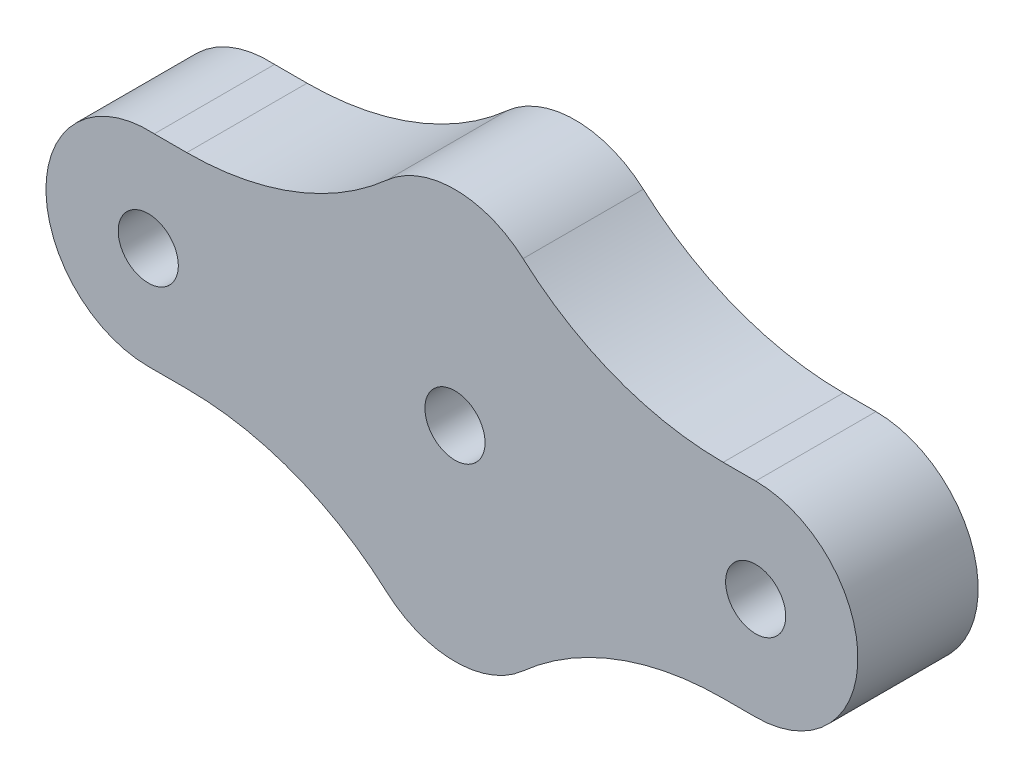
ISO-10303-21;
HEADER;
FILE_DESCRIPTION(('STEP AP214'),'2;1');
FILE_NAME('part.step','',(''),(''),'','','');
FILE_SCHEMA(('AUTOMOTIVE_DESIGN { 1 0 10303 214 1 1 1 1 }'));
ENDSEC;
DATA;
#1=APPLICATION_CONTEXT('core data for automotive mechanical design processes');
#2=APPLICATION_PROTOCOL_DEFINITION('international standard','automotive_design',2000,#1);
#3=PRODUCT_CONTEXT('',#1,'mechanical');
#4=PRODUCT('Part','Part','',(#3));
#5=PRODUCT_RELATED_PRODUCT_CATEGORY('part','',(#4));
#6=PRODUCT_DEFINITION_FORMATION('','',#4);
#7=PRODUCT_DEFINITION_CONTEXT('part definition',#1,'design');
#8=PRODUCT_DEFINITION('design','',#6,#7);
#9=PRODUCT_DEFINITION_SHAPE('','',#8);
#10=(LENGTH_UNIT() NAMED_UNIT(*) SI_UNIT(.MILLI.,.METRE.));
#11=(NAMED_UNIT(*) PLANE_ANGLE_UNIT() SI_UNIT($,.RADIAN.));
#12=(NAMED_UNIT(*) SI_UNIT($,.STERADIAN.) SOLID_ANGLE_UNIT());
#13=UNCERTAINTY_MEASURE_WITH_UNIT(LENGTH_MEASURE(1.E-05),#10,'distance_accuracy_value','');
#14=(GEOMETRIC_REPRESENTATION_CONTEXT(3) GLOBAL_UNCERTAINTY_ASSIGNED_CONTEXT((#13)) GLOBAL_UNIT_ASSIGNED_CONTEXT((#10,
#11,#12)) REPRESENTATION_CONTEXT('',''));
#15=CARTESIAN_POINT('',(0.,0.,0.));
#16=DIRECTION('',(0.,0.,1.));
#17=DIRECTION('',(1.,0.,0.));
#18=AXIS2_PLACEMENT_3D('',#15,#16,#17);
#19=CARTESIAN_POINT('',(-0.1,-1.69852941176471,2.));
#20=DIRECTION('',(0.,0.,-1.));
#21=DIRECTION('',(-1.,0.,0.));
#22=AXIS2_PLACEMENT_3D('',#19,#20,#21);
#23=PLANE('',#22);
#24=CARTESIAN_POINT('',(-0.1,-1.69852941176471,2.));
#25=DIRECTION('',(0.,0.,1.));
#26=DIRECTION('',(-1.,0.,0.));
#27=AXIS2_PLACEMENT_3D('',#24,#25,#26);
#28=CIRCLE('',#27,1.70147058823529);
#29=CARTESIAN_POINT('',(0.,0.,2.));
#30=VERTEX_POINT('',#29);
#31=CARTESIAN_POINT('',(-0.1,-3.4,2.));
#32=VERTEX_POINT('',#31);
#33=EDGE_CURVE('E127',#30,#32,#28,.T.);
#34=ORIENTED_EDGE('',*,*,#33,.T.);
#35=DIRECTION('',(1.,0.,0.));
#36=VECTOR('',#35,1.);
#37=CARTESIAN_POINT('',(3.3,-3.4,2.));
#38=LINE('',#37,#36);
#39=CARTESIAN_POINT('',(0.540179375804449,-3.4,2.));
#40=VERTEX_POINT('',#39);
#41=EDGE_CURVE('E118',#32,#40,#38,.T.);
#42=ORIENTED_EDGE('',*,*,#41,.T.);
#43=CARTESIAN_POINT('',(0.54017937580445,-8.4,2.));
#44=DIRECTION('',(0.,0.,-1.));
#45=DIRECTION('',(-1.,0.,0.));
#46=AXIS2_PLACEMENT_3D('',#43,#44,#45);
#47=CIRCLE('',#46,5.);
#48=CARTESIAN_POINT('',(3.86840372221904,-4.66865671641791,2.));
#49=VERTEX_POINT('',#48);
#50=EDGE_CURVE('E11',#40,#49,#47,.T.);
#51=ORIENTED_EDGE('',*,*,#50,.T.);
#52=CARTESIAN_POINT('',(5.,-3.4,2.));
#53=DIRECTION('',(0.,0.,1.));
#54=DIRECTION('',(-1.,0.,0.));
#55=AXIS2_PLACEMENT_3D('',#52,#53,#54);
#56=CIRCLE('',#55,1.7);
#57=CARTESIAN_POINT('',(6.13159627778096,-4.66865671641791,2.));
#58=VERTEX_POINT('',#57);
#59=EDGE_CURVE('E126',#49,#58,#56,.T.);
#60=ORIENTED_EDGE('',*,*,#59,.T.);
#61=CARTESIAN_POINT('',(9.45982062419555,-8.4,2.));
#62=DIRECTION('',(0.,0.,-1.));
#63=DIRECTION('',(-1.,0.,0.));
#64=AXIS2_PLACEMENT_3D('',#61,#62,#63);
#65=CIRCLE('',#64,5.);
#66=CARTESIAN_POINT('',(9.45982062419555,-3.4,2.));
#67=VERTEX_POINT('',#66);
#68=EDGE_CURVE('E169',#58,#67,#65,.T.);
#69=ORIENTED_EDGE('',*,*,#68,.T.);
#70=DIRECTION('',(1.,0.,0.));
#71=VECTOR('',#70,1.);
#72=CARTESIAN_POINT('',(10.,-3.4,2.));
#73=LINE('',#72,#71);
#74=CARTESIAN_POINT('',(10.,-3.4,2.));
#75=VERTEX_POINT('',#74);
#76=EDGE_CURVE('E226',#67,#75,#73,.T.);
#77=ORIENTED_EDGE('',*,*,#76,.T.);
#78=CARTESIAN_POINT('',(10.,-1.7,2.));
#79=DIRECTION('',(0.,0.,1.));
#80=DIRECTION('',(-1.,0.,0.));
#81=AXIS2_PLACEMENT_3D('',#78,#79,#80);
#82=CIRCLE('',#81,1.7);
#83=CARTESIAN_POINT('',(10.,0.,2.));
#84=VERTEX_POINT('',#83);
#85=EDGE_CURVE('E223',#75,#84,#82,.T.);
#86=ORIENTED_EDGE('',*,*,#85,.T.);
#87=DIRECTION('',(-1.,0.,0.));
#88=VECTOR('',#87,1.);
#89=CARTESIAN_POINT('',(6.7,0.,2.));
#90=LINE('',#89,#88);
#91=CARTESIAN_POINT('',(9.45982062419555,0.,2.));
#92=VERTEX_POINT('',#91);
#93=EDGE_CURVE('E215',#84,#92,#90,.T.);
#94=ORIENTED_EDGE('',*,*,#93,.T.);
#95=CARTESIAN_POINT('',(9.45982062419555,5.,2.));
#96=DIRECTION('',(0.,0.,-1.));
#97=DIRECTION('',(-1.,0.,0.));
#98=AXIS2_PLACEMENT_3D('',#95,#96,#97);
#99=CIRCLE('',#98,5.);
#100=CARTESIAN_POINT('',(6.13159627778096,1.26865671641791,2.));
#101=VERTEX_POINT('',#100);
#102=EDGE_CURVE('E173',#92,#101,#99,.T.);
#103=ORIENTED_EDGE('',*,*,#102,.T.);
#104=CARTESIAN_POINT('',(5.,0.,2.));
#105=DIRECTION('',(0.,0.,1.));
#106=DIRECTION('',(-1.,0.,0.));
#107=AXIS2_PLACEMENT_3D('',#104,#105,#106);
#108=CIRCLE('',#107,1.7);
#109=CARTESIAN_POINT('',(3.86840372221904,1.26865671641791,2.));
#110=VERTEX_POINT('',#109);
#111=EDGE_CURVE('E181',#101,#110,#108,.T.);
#112=ORIENTED_EDGE('',*,*,#111,.T.);
#113=CARTESIAN_POINT('',(0.540179375804448,5.,2.));
#114=DIRECTION('',(0.,0.,-1.));
#115=DIRECTION('',(-1.,0.,0.));
#116=AXIS2_PLACEMENT_3D('',#113,#114,#115);
#117=CIRCLE('',#116,5.);
#118=CARTESIAN_POINT('',(0.540179375804448,0.,2.));
#119=VERTEX_POINT('',#118);
#120=EDGE_CURVE('E177',#110,#119,#117,.T.);
#121=ORIENTED_EDGE('',*,*,#120,.T.);
#122=DIRECTION('',(-1.,0.,0.));
#123=VECTOR('',#122,1.);
#124=CARTESIAN_POINT('',(0.,0.,2.));
#125=LINE('',#124,#123);
#126=EDGE_CURVE('E132',#119,#30,#125,.T.);
#127=ORIENTED_EDGE('',*,*,#126,.T.);
#128=EDGE_LOOP('',(#34,#42,#51,#60,#69,#77,#86,#94,#103,#112,#121,#127));
#129=FACE_BOUND('',#128,.T.);
#130=CARTESIAN_POINT('',(-0.1,-1.69852941176471,2.));
#131=DIRECTION('',(0.,0.,1.));
#132=DIRECTION('',(1.,0.,0.));
#133=AXIS2_PLACEMENT_3D('',#130,#131,#132);
#134=CIRCLE('',#133,0.5);
#135=CARTESIAN_POINT('',(0.4,-1.69852941176471,2.));
#136=VERTEX_POINT('',#135);
#137=EDGE_CURVE('E232',#136,#136,#134,.T.);
#138=ORIENTED_EDGE('',*,*,#137,.F.);
#139=EDGE_LOOP('',(#138));
#140=FACE_BOUND('',#139,.T.);
#141=CARTESIAN_POINT('',(10.,-1.7,2.));
#142=DIRECTION('',(0.,0.,1.));
#143=DIRECTION('',(1.,0.,0.));
#144=AXIS2_PLACEMENT_3D('',#141,#142,#143);
#145=CIRCLE('',#144,0.500000000000001);
#146=CARTESIAN_POINT('',(10.5,-1.7,2.));
#147=VERTEX_POINT('',#146);
#148=EDGE_CURVE('E258',#147,#147,#145,.T.);
#149=ORIENTED_EDGE('',*,*,#148,.F.);
#150=EDGE_LOOP('',(#149));
#151=FACE_BOUND('',#150,.T.);
#152=CARTESIAN_POINT('',(5.,-1.7,2.));
#153=DIRECTION('',(0.,0.,1.));
#154=DIRECTION('',(1.,0.,0.));
#155=AXIS2_PLACEMENT_3D('',#152,#153,#154);
#156=CIRCLE('',#155,0.5);
#157=CARTESIAN_POINT('',(5.5,-1.7,2.));
#158=VERTEX_POINT('',#157);
#159=EDGE_CURVE('E264',#158,#158,#156,.T.);
#160=ORIENTED_EDGE('',*,*,#159,.F.);
#161=EDGE_LOOP('',(#160));
#162=FACE_BOUND('',#161,.T.);
#163=ADVANCED_FACE('F33',(#129,#140,#151,#162),#23,.F.);
#164=CARTESIAN_POINT('',(-0.1,-1.69852941176471,0.));
#165=DIRECTION('',(0.,0.,-1.));
#166=DIRECTION('',(-1.,0.,0.));
#167=AXIS2_PLACEMENT_3D('',#164,#165,#166);
#168=PLANE('',#167);
#169=CARTESIAN_POINT('',(10.,-1.7,0.));
#170=DIRECTION('',(0.,0.,1.));
#171=DIRECTION('',(1.,0.,0.));
#172=AXIS2_PLACEMENT_3D('',#169,#170,#171);
#173=CIRCLE('',#172,0.500000000000001);
#174=CARTESIAN_POINT('',(10.5,-1.7,0.));
#175=VERTEX_POINT('',#174);
#176=EDGE_CURVE('E261',#175,#175,#173,.T.);
#177=ORIENTED_EDGE('',*,*,#176,.T.);
#178=EDGE_LOOP('',(#177));
#179=FACE_BOUND('',#178,.T.);
#180=CARTESIAN_POINT('',(-0.1,-1.69852941176471,0.));
#181=DIRECTION('',(0.,0.,1.));
#182=DIRECTION('',(-1.,0.,0.));
#183=AXIS2_PLACEMENT_3D('',#180,#181,#182);
#184=CIRCLE('',#183,1.70147058823529);
#185=CARTESIAN_POINT('',(0.,0.,0.));
#186=VERTEX_POINT('',#185);
#187=CARTESIAN_POINT('',(-0.1,-3.4,0.));
#188=VERTEX_POINT('',#187);
#189=EDGE_CURVE('E140',#186,#188,#184,.T.);
#190=ORIENTED_EDGE('',*,*,#189,.F.);
#191=DIRECTION('',(-1.,0.,0.));
#192=VECTOR('',#191,1.);
#193=CARTESIAN_POINT('',(0.,0.,0.));
#194=LINE('',#193,#192);
#195=CARTESIAN_POINT('',(0.540179375804448,0.,0.));
#196=VERTEX_POINT('',#195);
#197=EDGE_CURVE('E136',#196,#186,#194,.T.);
#198=ORIENTED_EDGE('',*,*,#197,.F.);
#199=CARTESIAN_POINT('',(0.540179375804448,5.,0.));
#200=DIRECTION('',(0.,0.,-1.));
#201=DIRECTION('',(-1.,0.,0.));
#202=AXIS2_PLACEMENT_3D('',#199,#200,#201);
#203=CIRCLE('',#202,5.);
#204=CARTESIAN_POINT('',(3.86840372221904,1.26865671641791,0.));
#205=VERTEX_POINT('',#204);
#206=EDGE_CURVE('E175',#196,#205,#203,.F.);
#207=ORIENTED_EDGE('',*,*,#206,.T.);
#208=CARTESIAN_POINT('',(5.,0.,0.));
#209=DIRECTION('',(0.,0.,1.));
#210=DIRECTION('',(-1.,0.,0.));
#211=AXIS2_PLACEMENT_3D('',#208,#209,#210);
#212=CIRCLE('',#211,1.7);
#213=CARTESIAN_POINT('',(6.13159627778096,1.26865671641791,0.));
#214=VERTEX_POINT('',#213);
#215=EDGE_CURVE('E195',#214,#205,#212,.T.);
#216=ORIENTED_EDGE('',*,*,#215,.F.);
#217=CARTESIAN_POINT('',(9.45982062419555,5.,0.));
#218=DIRECTION('',(0.,0.,-1.));
#219=DIRECTION('',(-1.,0.,0.));
#220=AXIS2_PLACEMENT_3D('',#217,#218,#219);
#221=CIRCLE('',#220,5.);
#222=CARTESIAN_POINT('',(9.45982062419555,0.,0.));
#223=VERTEX_POINT('',#222);
#224=EDGE_CURVE('E171',#214,#223,#221,.F.);
#225=ORIENTED_EDGE('',*,*,#224,.T.);
#226=DIRECTION('',(-1.,0.,0.));
#227=VECTOR('',#226,1.);
#228=CARTESIAN_POINT('',(6.7,0.,0.));
#229=LINE('',#228,#227);
#230=CARTESIAN_POINT('',(10.,0.,0.));
#231=VERTEX_POINT('',#230);
#232=EDGE_CURVE('E199',#231,#223,#229,.T.);
#233=ORIENTED_EDGE('',*,*,#232,.F.);
#234=CARTESIAN_POINT('',(10.,-1.7,0.));
#235=DIRECTION('',(0.,0.,1.));
#236=DIRECTION('',(-1.,0.,0.));
#237=AXIS2_PLACEMENT_3D('',#234,#235,#236);
#238=CIRCLE('',#237,1.7);
#239=CARTESIAN_POINT('',(10.,-3.4,0.));
#240=VERTEX_POINT('',#239);
#241=EDGE_CURVE('E203',#240,#231,#238,.T.);
#242=ORIENTED_EDGE('',*,*,#241,.F.);
#243=DIRECTION('',(1.,0.,0.));
#244=VECTOR('',#243,1.);
#245=CARTESIAN_POINT('',(10.,-3.4,0.));
#246=LINE('',#245,#244);
#247=CARTESIAN_POINT('',(9.45982062419555,-3.4,0.));
#248=VERTEX_POINT('',#247);
#249=EDGE_CURVE('E237',#248,#240,#246,.T.);
#250=ORIENTED_EDGE('',*,*,#249,.F.);
#251=CARTESIAN_POINT('',(9.45982062419555,-8.4,0.));
#252=DIRECTION('',(0.,0.,-1.));
#253=DIRECTION('',(-1.,0.,0.));
#254=AXIS2_PLACEMENT_3D('',#251,#252,#253);
#255=CIRCLE('',#254,5.);
#256=CARTESIAN_POINT('',(6.13159627778096,-4.66865671641791,0.));
#257=VERTEX_POINT('',#256);
#258=EDGE_CURVE('E167',#248,#257,#255,.F.);
#259=ORIENTED_EDGE('',*,*,#258,.T.);
#260=CARTESIAN_POINT('',(5.,-3.4,0.));
#261=DIRECTION('',(0.,0.,1.));
#262=DIRECTION('',(-1.,0.,0.));
#263=AXIS2_PLACEMENT_3D('',#260,#261,#262);
#264=CIRCLE('',#263,1.7);
#265=CARTESIAN_POINT('',(3.86840372221904,-4.66865671641791,0.));
#266=VERTEX_POINT('',#265);
#267=EDGE_CURVE('E234',#266,#257,#264,.T.);
#268=ORIENTED_EDGE('',*,*,#267,.F.);
#269=CARTESIAN_POINT('',(0.54017937580445,-8.4,0.));
#270=DIRECTION('',(0.,0.,-1.));
#271=DIRECTION('',(-1.,0.,0.));
#272=AXIS2_PLACEMENT_3D('',#269,#270,#271);
#273=CIRCLE('',#272,5.);
#274=CARTESIAN_POINT('',(0.540179375804449,-3.4,0.));
#275=VERTEX_POINT('',#274);
#276=EDGE_CURVE('E41',#266,#275,#273,.F.);
#277=ORIENTED_EDGE('',*,*,#276,.T.);
#278=DIRECTION('',(1.,0.,0.));
#279=VECTOR('',#278,1.);
#280=CARTESIAN_POINT('',(3.3,-3.4,0.));
#281=LINE('',#280,#279);
#282=EDGE_CURVE('E231',#188,#275,#281,.T.);
#283=ORIENTED_EDGE('',*,*,#282,.F.);
#284=EDGE_LOOP('',(#190,#198,#207,#216,#225,#233,#242,#250,#259,#268,#277,#283));
#285=FACE_BOUND('',#284,.T.);
#286=CARTESIAN_POINT('',(-0.1,-1.69852941176471,0.));
#287=DIRECTION('',(0.,0.,1.));
#288=DIRECTION('',(1.,0.,0.));
#289=AXIS2_PLACEMENT_3D('',#286,#287,#288);
#290=CIRCLE('',#289,0.5);
#291=CARTESIAN_POINT('',(0.4,-1.69852941176471,0.));
#292=VERTEX_POINT('',#291);
#293=EDGE_CURVE('E255',#292,#292,#290,.T.);
#294=ORIENTED_EDGE('',*,*,#293,.T.);
#295=EDGE_LOOP('',(#294));
#296=FACE_BOUND('',#295,.T.);
#297=CARTESIAN_POINT('',(5.,-1.7,0.));
#298=DIRECTION('',(0.,0.,1.));
#299=DIRECTION('',(1.,0.,0.));
#300=AXIS2_PLACEMENT_3D('',#297,#298,#299);
#301=CIRCLE('',#300,0.5);
#302=CARTESIAN_POINT('',(5.5,-1.7,0.));
#303=VERTEX_POINT('',#302);
#304=EDGE_CURVE('E267',#303,#303,#301,.T.);
#305=ORIENTED_EDGE('',*,*,#304,.T.);
#306=EDGE_LOOP('',(#305));
#307=FACE_BOUND('',#306,.T.);
#308=ADVANCED_FACE('F193',(#179,#285,#296,#307),#168,.T.);
#309=CARTESIAN_POINT('',(-0.1,-1.69852941176471,2.));
#310=DIRECTION('',(0.,0.,-1.));
#311=DIRECTION('',(-1.,0.,0.));
#312=AXIS2_PLACEMENT_3D('',#309,#310,#311);
#313=CYLINDRICAL_SURFACE('',#312,1.70147058823529);
#314=ORIENTED_EDGE('',*,*,#189,.T.);
#315=DIRECTION('',(0.,0.,-1.));
#316=VECTOR('',#315,1.);
#317=CARTESIAN_POINT('',(-0.1,-3.4,2.));
#318=LINE('',#317,#316);
#319=EDGE_CURVE('E122',#32,#188,#318,.T.);
#320=ORIENTED_EDGE('',*,*,#319,.F.);
#321=ORIENTED_EDGE('',*,*,#33,.F.);
#322=DIRECTION('',(0.,0.,-1.));
#323=VECTOR('',#322,1.);
#324=CARTESIAN_POINT('',(0.,0.,2.));
#325=LINE('',#324,#323);
#326=EDGE_CURVE('E188',#30,#186,#325,.T.);
#327=ORIENTED_EDGE('',*,*,#326,.T.);
#328=EDGE_LOOP('',(#314,#320,#321,#327));
#329=FACE_BOUND('',#328,.T.);
#330=ADVANCED_FACE('F138',(#329),#313,.T.);
#331=CARTESIAN_POINT('',(3.3,-3.4,2.));
#332=DIRECTION('',(0.,1.,0.));
#333=DIRECTION('',(-1.,0.,0.));
#334=AXIS2_PLACEMENT_3D('',#331,#332,#333);
#335=PLANE('',#334);
#336=ORIENTED_EDGE('',*,*,#282,.T.);
#337=DIRECTION('',(0.,0.,1.));
#338=VECTOR('',#337,1.);
#339=CARTESIAN_POINT('',(0.540179375804449,-3.4,2.));
#340=LINE('',#339,#338);
#341=EDGE_CURVE('E48',#275,#40,#340,.T.);
#342=ORIENTED_EDGE('',*,*,#341,.T.);
#343=ORIENTED_EDGE('',*,*,#41,.F.);
#344=ORIENTED_EDGE('',*,*,#319,.T.);
#345=EDGE_LOOP('',(#336,#342,#343,#344));
#346=FACE_BOUND('',#345,.T.);
#347=ADVANCED_FACE('F120',(#346),#335,.F.);
#348=CARTESIAN_POINT('',(5.,-3.4,2.));
#349=DIRECTION('',(0.,0.,-1.));
#350=DIRECTION('',(-1.,0.,0.));
#351=AXIS2_PLACEMENT_3D('',#348,#349,#350);
#352=CYLINDRICAL_SURFACE('',#351,1.7);
#353=ORIENTED_EDGE('',*,*,#267,.T.);
#354=DIRECTION('',(0.,0.,-1.));
#355=VECTOR('',#354,1.);
#356=CARTESIAN_POINT('',(6.13159627778096,-4.66865671641791,2.));
#357=LINE('',#356,#355);
#358=EDGE_CURVE('E154',#257,#58,#357,.F.);
#359=ORIENTED_EDGE('',*,*,#358,.T.);
#360=ORIENTED_EDGE('',*,*,#59,.F.);
#361=DIRECTION('',(0.,0.,-1.));
#362=VECTOR('',#361,1.);
#363=CARTESIAN_POINT('',(3.86840372221904,-4.66865671641791,2.));
#364=LINE('',#363,#362);
#365=EDGE_CURVE('E145',#49,#266,#364,.T.);
#366=ORIENTED_EDGE('',*,*,#365,.T.);
#367=EDGE_LOOP('',(#353,#359,#360,#366));
#368=FACE_BOUND('',#367,.T.);
#369=ADVANCED_FACE('F247',(#368),#352,.T.);
#370=CARTESIAN_POINT('',(10.,-3.4,2.));
#371=DIRECTION('',(0.,1.,0.));
#372=DIRECTION('',(-1.,0.,0.));
#373=AXIS2_PLACEMENT_3D('',#370,#371,#372);
#374=PLANE('',#373);
#375=ORIENTED_EDGE('',*,*,#76,.F.);
#376=DIRECTION('',(0.,0.,1.));
#377=VECTOR('',#376,1.);
#378=CARTESIAN_POINT('',(9.45982062419555,-3.4,0.));
#379=LINE('',#378,#377);
#380=EDGE_CURVE('E141',#67,#248,#379,.F.);
#381=ORIENTED_EDGE('',*,*,#380,.T.);
#382=ORIENTED_EDGE('',*,*,#249,.T.);
#383=DIRECTION('',(0.,0.,-1.));
#384=VECTOR('',#383,1.);
#385=CARTESIAN_POINT('',(10.,-3.4,2.));
#386=LINE('',#385,#384);
#387=EDGE_CURVE('E142',#75,#240,#386,.T.);
#388=ORIENTED_EDGE('',*,*,#387,.F.);
#389=EDGE_LOOP('',(#375,#381,#382,#388));
#390=FACE_BOUND('',#389,.T.);
#391=ADVANCED_FACE('F242',(#390),#374,.F.);
#392=CARTESIAN_POINT('',(10.,-1.7,2.));
#393=DIRECTION('',(0.,0.,-1.));
#394=DIRECTION('',(-1.,0.,0.));
#395=AXIS2_PLACEMENT_3D('',#392,#393,#394);
#396=CYLINDRICAL_SURFACE('',#395,1.7);
#397=ORIENTED_EDGE('',*,*,#241,.T.);
#398=DIRECTION('',(0.,0.,-1.));
#399=VECTOR('',#398,1.);
#400=CARTESIAN_POINT('',(10.,0.,2.));
#401=LINE('',#400,#399);
#402=EDGE_CURVE('E148',#84,#231,#401,.T.);
#403=ORIENTED_EDGE('',*,*,#402,.F.);
#404=ORIENTED_EDGE('',*,*,#85,.F.);
#405=ORIENTED_EDGE('',*,*,#387,.T.);
#406=EDGE_LOOP('',(#397,#403,#404,#405));
#407=FACE_BOUND('',#406,.T.);
#408=ADVANCED_FACE('F238',(#407),#396,.T.);
#409=CARTESIAN_POINT('',(6.7,0.,2.));
#410=DIRECTION('',(0.,-1.,0.));
#411=DIRECTION('',(0.,0.,-1.));
#412=AXIS2_PLACEMENT_3D('',#409,#410,#411);
#413=PLANE('',#412);
#414=ORIENTED_EDGE('',*,*,#232,.T.);
#415=DIRECTION('',(0.,0.,1.));
#416=VECTOR('',#415,1.);
#417=CARTESIAN_POINT('',(9.45982062419555,0.,2.));
#418=LINE('',#417,#416);
#419=EDGE_CURVE('E161',#223,#92,#418,.T.);
#420=ORIENTED_EDGE('',*,*,#419,.T.);
#421=ORIENTED_EDGE('',*,*,#93,.F.);
#422=ORIENTED_EDGE('',*,*,#402,.T.);
#423=EDGE_LOOP('',(#414,#420,#421,#422));
#424=FACE_BOUND('',#423,.T.);
#425=ADVANCED_FACE('F212',(#424),#413,.F.);
#426=CARTESIAN_POINT('',(5.,0.,2.));
#427=DIRECTION('',(0.,0.,-1.));
#428=DIRECTION('',(-1.,0.,0.));
#429=AXIS2_PLACEMENT_3D('',#426,#427,#428);
#430=CYLINDRICAL_SURFACE('',#429,1.7);
#431=ORIENTED_EDGE('',*,*,#111,.F.);
#432=DIRECTION('',(0.,0.,-1.));
#433=VECTOR('',#432,1.);
#434=CARTESIAN_POINT('',(6.13159627778096,1.26865671641791,2.));
#435=LINE('',#434,#433);
#436=EDGE_CURVE('E158',#101,#214,#435,.T.);
#437=ORIENTED_EDGE('',*,*,#436,.T.);
#438=ORIENTED_EDGE('',*,*,#215,.T.);
#439=DIRECTION('',(0.,0.,-1.));
#440=VECTOR('',#439,1.);
#441=CARTESIAN_POINT('',(3.86840372221904,1.26865671641791,2.));
#442=LINE('',#441,#440);
#443=EDGE_CURVE('E156',#205,#110,#442,.F.);
#444=ORIENTED_EDGE('',*,*,#443,.T.);
#445=EDGE_LOOP('',(#431,#437,#438,#444));
#446=FACE_BOUND('',#445,.T.);
#447=ADVANCED_FACE('F197',(#446),#430,.T.);
#448=CARTESIAN_POINT('',(0.,0.,2.));
#449=DIRECTION('',(0.,-1.,0.));
#450=DIRECTION('',(0.,0.,-1.));
#451=AXIS2_PLACEMENT_3D('',#448,#449,#450);
#452=PLANE('',#451);
#453=ORIENTED_EDGE('',*,*,#126,.F.);
#454=DIRECTION('',(0.,0.,1.));
#455=VECTOR('',#454,1.);
#456=CARTESIAN_POINT('',(0.540179375804448,0.,0.));
#457=LINE('',#456,#455);
#458=EDGE_CURVE('E163',#119,#196,#457,.F.);
#459=ORIENTED_EDGE('',*,*,#458,.T.);
#460=ORIENTED_EDGE('',*,*,#197,.T.);
#461=ORIENTED_EDGE('',*,*,#326,.F.);
#462=EDGE_LOOP('',(#453,#459,#460,#461));
#463=FACE_BOUND('',#462,.T.);
#464=ADVANCED_FACE('F186',(#463),#452,.F.);
#465=CARTESIAN_POINT('',(-0.1,-1.69852941176471,2.));
#466=DIRECTION('',(0.,0.,-1.));
#467=DIRECTION('',(-1.,0.,0.));
#468=AXIS2_PLACEMENT_3D('',#465,#466,#467);
#469=CYLINDRICAL_SURFACE('',#468,0.5);
#470=ORIENTED_EDGE('',*,*,#137,.T.);
#471=EDGE_LOOP('',(#470));
#472=FACE_BOUND('',#471,.T.);
#473=ORIENTED_EDGE('',*,*,#293,.F.);
#474=EDGE_LOOP('',(#473));
#475=FACE_BOUND('',#474,.T.);
#476=ADVANCED_FACE('F284',(#472,#475),#469,.F.);
#477=CARTESIAN_POINT('',(10.,-1.7,2.));
#478=DIRECTION('',(0.,0.,-1.));
#479=DIRECTION('',(-1.,0.,0.));
#480=AXIS2_PLACEMENT_3D('',#477,#478,#479);
#481=CYLINDRICAL_SURFACE('',#480,0.500000000000001);
#482=ORIENTED_EDGE('',*,*,#148,.T.);
#483=EDGE_LOOP('',(#482));
#484=FACE_BOUND('',#483,.T.);
#485=ORIENTED_EDGE('',*,*,#176,.F.);
#486=EDGE_LOOP('',(#485));
#487=FACE_BOUND('',#486,.T.);
#488=ADVANCED_FACE('F388',(#484,#487),#481,.F.);
#489=CARTESIAN_POINT('',(5.,-1.7,2.));
#490=DIRECTION('',(0.,0.,-1.));
#491=DIRECTION('',(-1.,0.,0.));
#492=AXIS2_PLACEMENT_3D('',#489,#490,#491);
#493=CYLINDRICAL_SURFACE('',#492,0.5);
#494=ORIENTED_EDGE('',*,*,#159,.T.);
#495=EDGE_LOOP('',(#494));
#496=FACE_BOUND('',#495,.T.);
#497=ORIENTED_EDGE('',*,*,#304,.F.);
#498=EDGE_LOOP('',(#497));
#499=FACE_BOUND('',#498,.T.);
#500=ADVANCED_FACE('F273',(#496,#499),#493,.F.);
#501=CARTESIAN_POINT('',(9.45982062419555,-8.4,2.));
#502=DIRECTION('',(0.,0.,-1.));
#503=DIRECTION('',(-1.,0.,0.));
#504=AXIS2_PLACEMENT_3D('',#501,#502,#503);
#505=CYLINDRICAL_SURFACE('',#504,5.);
#506=ORIENTED_EDGE('',*,*,#68,.F.);
#507=ORIENTED_EDGE('',*,*,#358,.F.);
#508=ORIENTED_EDGE('',*,*,#258,.F.);
#509=ORIENTED_EDGE('',*,*,#380,.F.);
#510=EDGE_LOOP('',(#506,#507,#508,#509));
#511=FACE_BOUND('',#510,.T.);
#512=ADVANCED_FACE('F252',(#511),#505,.F.);
#513=CARTESIAN_POINT('',(9.45982062419555,5.,2.));
#514=DIRECTION('',(0.,0.,-1.));
#515=DIRECTION('',(-1.,0.,0.));
#516=AXIS2_PLACEMENT_3D('',#513,#514,#515);
#517=CYLINDRICAL_SURFACE('',#516,5.);
#518=ORIENTED_EDGE('',*,*,#102,.F.);
#519=ORIENTED_EDGE('',*,*,#419,.F.);
#520=ORIENTED_EDGE('',*,*,#224,.F.);
#521=ORIENTED_EDGE('',*,*,#436,.F.);
#522=EDGE_LOOP('',(#518,#519,#520,#521));
#523=FACE_BOUND('',#522,.T.);
#524=ADVANCED_FACE('F222',(#523),#517,.F.);
#525=CARTESIAN_POINT('',(0.540179375804448,5.,2.));
#526=DIRECTION('',(0.,0.,-1.));
#527=DIRECTION('',(-1.,0.,0.));
#528=AXIS2_PLACEMENT_3D('',#525,#526,#527);
#529=CYLINDRICAL_SURFACE('',#528,5.);
#530=ORIENTED_EDGE('',*,*,#120,.F.);
#531=ORIENTED_EDGE('',*,*,#443,.F.);
#532=ORIENTED_EDGE('',*,*,#206,.F.);
#533=ORIENTED_EDGE('',*,*,#458,.F.);
#534=EDGE_LOOP('',(#530,#531,#532,#533));
#535=FACE_BOUND('',#534,.T.);
#536=ADVANCED_FACE('F190',(#535),#529,.F.);
#537=CARTESIAN_POINT('',(0.54017937580445,-8.4,2.));
#538=DIRECTION('',(0.,0.,-1.));
#539=DIRECTION('',(-1.,0.,0.));
#540=AXIS2_PLACEMENT_3D('',#537,#538,#539);
#541=CYLINDRICAL_SURFACE('',#540,5.);
#542=ORIENTED_EDGE('',*,*,#50,.F.);
#543=ORIENTED_EDGE('',*,*,#341,.F.);
#544=ORIENTED_EDGE('',*,*,#276,.F.);
#545=ORIENTED_EDGE('',*,*,#365,.F.);
#546=EDGE_LOOP('',(#542,#543,#544,#545));
#547=FACE_BOUND('',#546,.T.);
#548=ADVANCED_FACE('F35',(#547),#541,.F.);
#549=CLOSED_SHELL('',(#163,#308,#330,#347,#369,#391,#408,#425,#447,#464,#476,#488,#500,#512,
#524,#536,#548));
#550=MANIFOLD_SOLID_BREP('B2',#549);
#551=ADVANCED_BREP_SHAPE_REPRESENTATION('',(#18,#550),#14);
#552=SHAPE_DEFINITION_REPRESENTATION(#9,#551);
ENDSEC;
END-ISO-10303-21;
